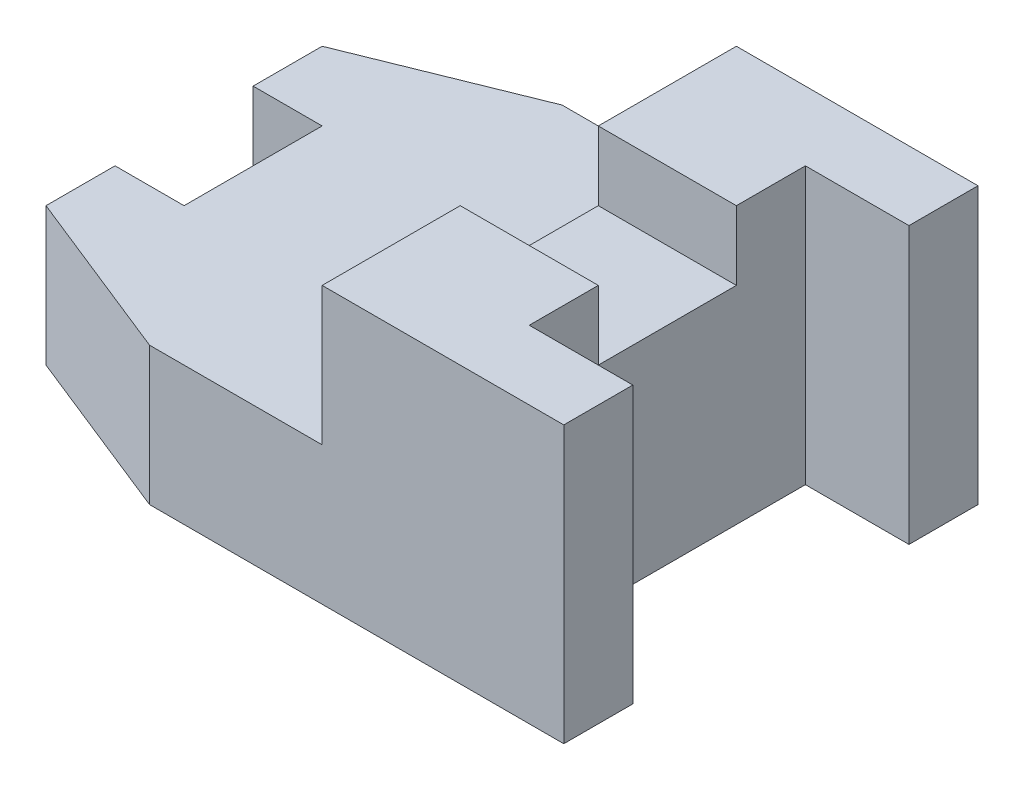
ISO-10303-21;
HEADER;
FILE_DESCRIPTION(('STEP AP214'),'2;1');
FILE_NAME('part.step','',(''),(''),'','','');
FILE_SCHEMA(('AUTOMOTIVE_DESIGN { 1 0 10303 214 1 1 1 1 }'));
ENDSEC;
DATA;
#1=APPLICATION_CONTEXT('core data for automotive mechanical design processes');
#2=APPLICATION_PROTOCOL_DEFINITION('international standard','automotive_design',2000,#1);
#3=PRODUCT_CONTEXT('',#1,'mechanical');
#4=PRODUCT('Part','Part','',(#3));
#5=PRODUCT_RELATED_PRODUCT_CATEGORY('part','',(#4));
#6=PRODUCT_DEFINITION_FORMATION('','',#4);
#7=PRODUCT_DEFINITION_CONTEXT('part definition',#1,'design');
#8=PRODUCT_DEFINITION('design','',#6,#7);
#9=PRODUCT_DEFINITION_SHAPE('','',#8);
#10=(LENGTH_UNIT() NAMED_UNIT(*) SI_UNIT(.MILLI.,.METRE.));
#11=(NAMED_UNIT(*) PLANE_ANGLE_UNIT() SI_UNIT($,.RADIAN.));
#12=(NAMED_UNIT(*) SI_UNIT($,.STERADIAN.) SOLID_ANGLE_UNIT());
#13=UNCERTAINTY_MEASURE_WITH_UNIT(LENGTH_MEASURE(1.E-05),#10,'distance_accuracy_value','');
#14=(GEOMETRIC_REPRESENTATION_CONTEXT(3) GLOBAL_UNCERTAINTY_ASSIGNED_CONTEXT((#13)) GLOBAL_UNIT_ASSIGNED_CONTEXT((#10,
#11,#12)) REPRESENTATION_CONTEXT('',''));
#15=CARTESIAN_POINT('',(0.,0.,0.));
#16=DIRECTION('',(0.,0.,1.));
#17=DIRECTION('',(1.,0.,0.));
#18=AXIS2_PLACEMENT_3D('',#15,#16,#17);
#19=CARTESIAN_POINT('',(-42.5,40.,30.));
#20=DIRECTION('',(1.,0.,0.));
#21=DIRECTION('',(0.,0.,-1.));
#22=AXIS2_PLACEMENT_3D('',#19,#20,#21);
#23=PLANE('',#22);
#24=DIRECTION('',(0.,1.,0.));
#25=VECTOR('',#24,1.);
#26=CARTESIAN_POINT('',(-42.5,0.,-20.));
#27=LINE('',#26,#25);
#28=CARTESIAN_POINT('',(-42.5,0.,-20.));
#29=VERTEX_POINT('',#28);
#30=CARTESIAN_POINT('',(-42.5,20.,-20.));
#31=VERTEX_POINT('',#30);
#32=EDGE_CURVE('E58',#29,#31,#27,.T.);
#33=ORIENTED_EDGE('',*,*,#32,.F.);
#34=DIRECTION('',(0.,0.,1.));
#35=VECTOR('',#34,1.);
#36=CARTESIAN_POINT('',(-42.5,0.,30.));
#37=LINE('',#36,#35);
#38=CARTESIAN_POINT('',(-42.5,0.,-10.));
#39=VERTEX_POINT('',#38);
#40=EDGE_CURVE('E183',#29,#39,#37,.T.);
#41=ORIENTED_EDGE('',*,*,#40,.T.);
#42=DIRECTION('',(0.,-1.,0.));
#43=VECTOR('',#42,1.);
#44=CARTESIAN_POINT('',(-42.5,20.,-10.));
#45=LINE('',#44,#43);
#46=CARTESIAN_POINT('',(-42.5,20.,-10.));
#47=VERTEX_POINT('',#46);
#48=EDGE_CURVE('E312',#47,#39,#45,.T.);
#49=ORIENTED_EDGE('',*,*,#48,.F.);
#50=DIRECTION('',(0.,0.,1.));
#51=VECTOR('',#50,1.);
#52=CARTESIAN_POINT('',(-42.5,20.,30.));
#53=LINE('',#52,#51);
#54=EDGE_CURVE('E185',#31,#47,#53,.T.);
#55=ORIENTED_EDGE('',*,*,#54,.F.);
#56=EDGE_LOOP('',(#33,#41,#49,#55));
#57=FACE_BOUND('',#56,.T.);
#58=ADVANCED_FACE('F36',(#57),#23,.F.);
#59=DIRECTION('',(0.,1.,0.));
#60=VECTOR('',#59,1.);
#61=CARTESIAN_POINT('',(-42.5,0.,20.));
#62=LINE('',#61,#60);
#63=CARTESIAN_POINT('',(-42.5,0.,20.));
#64=VERTEX_POINT('',#63);
#65=CARTESIAN_POINT('',(-42.5,20.,20.));
#66=VERTEX_POINT('',#65);
#67=EDGE_CURVE('E178',#64,#66,#62,.T.);
#68=ORIENTED_EDGE('',*,*,#67,.T.);
#69=CARTESIAN_POINT('',(-42.5,20.,10.));
#70=VERTEX_POINT('',#69);
#71=EDGE_CURVE('E291',#70,#66,#53,.T.);
#72=ORIENTED_EDGE('',*,*,#71,.F.);
#73=DIRECTION('',(0.,1.,0.));
#74=VECTOR('',#73,1.);
#75=CARTESIAN_POINT('',(-42.5,20.,10.));
#76=LINE('',#75,#74);
#77=CARTESIAN_POINT('',(-42.5,0.,10.));
#78=VERTEX_POINT('',#77);
#79=EDGE_CURVE('E309',#78,#70,#76,.T.);
#80=ORIENTED_EDGE('',*,*,#79,.F.);
#81=EDGE_CURVE('E192',#78,#64,#37,.T.);
#82=ORIENTED_EDGE('',*,*,#81,.T.);
#83=EDGE_LOOP('',(#68,#72,#80,#82));
#84=FACE_BOUND('',#83,.T.);
#85=ADVANCED_FACE('F388',(#84),#23,.F.);
#86=CARTESIAN_POINT('',(-42.5,40.,-30.));
#87=DIRECTION('',(0.,0.,1.));
#88=DIRECTION('',(1.,0.,0.));
#89=AXIS2_PLACEMENT_3D('',#86,#87,#88);
#90=PLANE('',#89);
#91=DIRECTION('',(0.,-1.,0.));
#92=VECTOR('',#91,1.);
#93=CARTESIAN_POINT('',(-17.7535111193881,40.,-30.));
#94=LINE('',#93,#92);
#95=CARTESIAN_POINT('',(-17.7535111193881,20.,-30.));
#96=VERTEX_POINT('',#95);
#97=CARTESIAN_POINT('',(-17.7535111193881,0.,-30.));
#98=VERTEX_POINT('',#97);
#99=EDGE_CURVE('E173',#96,#98,#94,.T.);
#100=ORIENTED_EDGE('',*,*,#99,.F.);
#101=DIRECTION('',(-1.,0.,0.));
#102=VECTOR('',#101,1.);
#103=CARTESIAN_POINT('',(-42.5,20.,-30.));
#104=LINE('',#103,#102);
#105=CARTESIAN_POINT('',(7.49999999999999,20.,-30.));
#106=VERTEX_POINT('',#105);
#107=EDGE_CURVE('E292',#106,#96,#104,.T.);
#108=ORIENTED_EDGE('',*,*,#107,.F.);
#109=DIRECTION('',(0.,1.,0.));
#110=VECTOR('',#109,1.);
#111=CARTESIAN_POINT('',(7.49999999999999,40.,-30.));
#112=LINE('',#111,#110);
#113=CARTESIAN_POINT('',(7.49999999999999,40.,-30.));
#114=VERTEX_POINT('',#113);
#115=EDGE_CURVE('E272',#106,#114,#112,.T.);
#116=ORIENTED_EDGE('',*,*,#115,.T.);
#117=DIRECTION('',(-1.,0.,0.));
#118=VECTOR('',#117,1.);
#119=CARTESIAN_POINT('',(-42.5,40.,-30.));
#120=LINE('',#119,#118);
#121=CARTESIAN_POINT('',(42.5,40.,-30.));
#122=VERTEX_POINT('',#121);
#123=EDGE_CURVE('E211',#122,#114,#120,.T.);
#124=ORIENTED_EDGE('',*,*,#123,.F.);
#125=DIRECTION('',(0.,-1.,0.));
#126=VECTOR('',#125,1.);
#127=CARTESIAN_POINT('',(42.5,40.,-30.));
#128=LINE('',#127,#126);
#129=CARTESIAN_POINT('',(42.5,0.,-30.));
#130=VERTEX_POINT('',#129);
#131=EDGE_CURVE('E44',#122,#130,#128,.T.);
#132=ORIENTED_EDGE('',*,*,#131,.T.);
#133=DIRECTION('',(-1.,0.,0.));
#134=VECTOR('',#133,1.);
#135=CARTESIAN_POINT('',(-42.5,0.,-30.));
#136=LINE('',#135,#134);
#137=EDGE_CURVE('E197',#130,#98,#136,.T.);
#138=ORIENTED_EDGE('',*,*,#137,.T.);
#139=EDGE_LOOP('',(#100,#108,#116,#124,#132,#138));
#140=FACE_BOUND('',#139,.T.);
#141=ADVANCED_FACE('F208',(#140),#90,.F.);
#142=CARTESIAN_POINT('',(-42.5,40.,30.));
#143=DIRECTION('',(0.,0.,-1.));
#144=DIRECTION('',(-1.,0.,0.));
#145=AXIS2_PLACEMENT_3D('',#142,#143,#144);
#146=PLANE('',#145);
#147=DIRECTION('',(0.,1.,0.));
#148=VECTOR('',#147,1.);
#149=CARTESIAN_POINT('',(-17.5,0.,30.));
#150=LINE('',#149,#148);
#151=CARTESIAN_POINT('',(-17.5,0.,30.));
#152=VERTEX_POINT('',#151);
#153=CARTESIAN_POINT('',(-17.5,20.,30.));
#154=VERTEX_POINT('',#153);
#155=EDGE_CURVE('E51',#152,#154,#150,.T.);
#156=ORIENTED_EDGE('',*,*,#155,.F.);
#157=DIRECTION('',(1.,0.,0.));
#158=VECTOR('',#157,1.);
#159=CARTESIAN_POINT('',(-42.5,0.,30.));
#160=LINE('',#159,#158);
#161=CARTESIAN_POINT('',(42.5,0.,30.));
#162=VERTEX_POINT('',#161);
#163=EDGE_CURVE('E191',#152,#162,#160,.T.);
#164=ORIENTED_EDGE('',*,*,#163,.T.);
#165=DIRECTION('',(0.,-1.,0.));
#166=VECTOR('',#165,1.);
#167=CARTESIAN_POINT('',(42.5,40.,30.));
#168=LINE('',#167,#166);
#169=CARTESIAN_POINT('',(42.5,40.,30.));
#170=VERTEX_POINT('',#169);
#171=EDGE_CURVE('E201',#170,#162,#168,.T.);
#172=ORIENTED_EDGE('',*,*,#171,.F.);
#173=DIRECTION('',(1.,0.,0.));
#174=VECTOR('',#173,1.);
#175=CARTESIAN_POINT('',(-42.5,40.,30.));
#176=LINE('',#175,#174);
#177=CARTESIAN_POINT('',(7.5,40.,30.));
#178=VERTEX_POINT('',#177);
#179=EDGE_CURVE('E203',#178,#170,#176,.T.);
#180=ORIENTED_EDGE('',*,*,#179,.F.);
#181=DIRECTION('',(0.,-1.,0.));
#182=VECTOR('',#181,1.);
#183=CARTESIAN_POINT('',(7.49999999999999,40.,30.));
#184=LINE('',#183,#182);
#185=CARTESIAN_POINT('',(7.49999999999999,20.,30.));
#186=VERTEX_POINT('',#185);
#187=EDGE_CURVE('E283',#178,#186,#184,.T.);
#188=ORIENTED_EDGE('',*,*,#187,.T.);
#189=DIRECTION('',(1.,0.,0.));
#190=VECTOR('',#189,1.);
#191=CARTESIAN_POINT('',(-42.5,20.,30.));
#192=LINE('',#191,#190);
#193=EDGE_CURVE('E287',#154,#186,#192,.T.);
#194=ORIENTED_EDGE('',*,*,#193,.F.);
#195=EDGE_LOOP('',(#156,#164,#172,#180,#188,#194));
#196=FACE_BOUND('',#195,.T.);
#197=ADVANCED_FACE('F336',(#196),#146,.F.);
#198=CARTESIAN_POINT('',(0.,0.,0.));
#199=DIRECTION('',(0.,-1.,0.));
#200=DIRECTION('',(0.,0.,-1.));
#201=AXIS2_PLACEMENT_3D('',#198,#199,#200);
#202=PLANE('',#201);
#203=ORIENTED_EDGE('',*,*,#40,.F.);
#204=DIRECTION('',(-0.927160826095299,0.,0.374663585839727));
#205=VECTOR('',#204,1.);
#206=CARTESIAN_POINT('',(-17.5,0.,-30.1024432680576));
#207=LINE('',#206,#205);
#208=EDGE_CURVE('E170',#98,#29,#207,.T.);
#209=ORIENTED_EDGE('',*,*,#208,.F.);
#210=ORIENTED_EDGE('',*,*,#137,.F.);
#211=DIRECTION('',(0.,0.,-1.));
#212=VECTOR('',#211,1.);
#213=CARTESIAN_POINT('',(42.5,0.,30.));
#214=LINE('',#213,#212);
#215=CARTESIAN_POINT('',(42.5,0.,-20.));
#216=VERTEX_POINT('',#215);
#217=EDGE_CURVE('E216',#216,#130,#214,.T.);
#218=ORIENTED_EDGE('',*,*,#217,.F.);
#219=DIRECTION('',(-1.,0.,0.));
#220=VECTOR('',#219,1.);
#221=CARTESIAN_POINT('',(42.5,0.,-20.));
#222=LINE('',#221,#220);
#223=CARTESIAN_POINT('',(27.5,0.,-20.));
#224=VERTEX_POINT('',#223);
#225=EDGE_CURVE('E241',#216,#224,#222,.T.);
#226=ORIENTED_EDGE('',*,*,#225,.T.);
#227=DIRECTION('',(0.,0.,1.));
#228=VECTOR('',#227,1.);
#229=CARTESIAN_POINT('',(27.5,0.,-20.));
#230=LINE('',#229,#228);
#231=CARTESIAN_POINT('',(27.5,0.,20.));
#232=VERTEX_POINT('',#231);
#233=EDGE_CURVE('E252',#224,#232,#230,.T.);
#234=ORIENTED_EDGE('',*,*,#233,.T.);
#235=DIRECTION('',(1.,0.,0.));
#236=VECTOR('',#235,1.);
#237=CARTESIAN_POINT('',(42.5,0.,20.));
#238=LINE('',#237,#236);
#239=CARTESIAN_POINT('',(42.5,0.,20.));
#240=VERTEX_POINT('',#239);
#241=EDGE_CURVE('E233',#232,#240,#238,.T.);
#242=ORIENTED_EDGE('',*,*,#241,.T.);
#243=EDGE_CURVE('E219',#162,#240,#214,.T.);
#244=ORIENTED_EDGE('',*,*,#243,.F.);
#245=ORIENTED_EDGE('',*,*,#163,.F.);
#246=DIRECTION('',(0.928476690885259,0.,0.371390676354104));
#247=VECTOR('',#246,1.);
#248=CARTESIAN_POINT('',(-42.5,0.,20.));
#249=LINE('',#248,#247);
#250=EDGE_CURVE('E325',#64,#152,#249,.T.);
#251=ORIENTED_EDGE('',*,*,#250,.F.);
#252=ORIENTED_EDGE('',*,*,#81,.F.);
#253=DIRECTION('',(-1.,0.,0.));
#254=VECTOR('',#253,1.);
#255=CARTESIAN_POINT('',(-32.5,0.,10.));
#256=LINE('',#255,#254);
#257=CARTESIAN_POINT('',(-32.5,0.,10.));
#258=VERTEX_POINT('',#257);
#259=EDGE_CURVE('E301',#258,#78,#256,.T.);
#260=ORIENTED_EDGE('',*,*,#259,.F.);
#261=DIRECTION('',(0.,0.,1.));
#262=VECTOR('',#261,1.);
#263=CARTESIAN_POINT('',(-32.5,0.,-10.));
#264=LINE('',#263,#262);
#265=CARTESIAN_POINT('',(-32.5,0.,-10.));
#266=VERTEX_POINT('',#265);
#267=EDGE_CURVE('E318',#266,#258,#264,.T.);
#268=ORIENTED_EDGE('',*,*,#267,.F.);
#269=DIRECTION('',(-1.,0.,0.));
#270=VECTOR('',#269,1.);
#271=CARTESIAN_POINT('',(-32.5,0.,-10.));
#272=LINE('',#271,#270);
#273=EDGE_CURVE('E190',#266,#39,#272,.T.);
#274=ORIENTED_EDGE('',*,*,#273,.T.);
#275=EDGE_LOOP('',(#203,#209,#210,#218,#226,#234,#242,#244,#245,#251,#252,#260,#268,#274));
#276=FACE_BOUND('',#275,.T.);
#277=ADVANCED_FACE('F188',(#276),#202,.T.);
#278=CARTESIAN_POINT('',(0.,20.,0.));
#279=DIRECTION('',(0.,-1.,0.));
#280=DIRECTION('',(0.,0.,-1.));
#281=AXIS2_PLACEMENT_3D('',#278,#279,#280);
#282=PLANE('',#281);
#283=DIRECTION('',(0.927160826095299,0.,-0.374663585839727));
#284=VECTOR('',#283,1.);
#285=CARTESIAN_POINT('',(-12.9133121036568,20.,-31.9559134385014));
#286=LINE('',#285,#284);
#287=EDGE_CURVE('E11',#31,#96,#286,.T.);
#288=ORIENTED_EDGE('',*,*,#287,.F.);
#289=ORIENTED_EDGE('',*,*,#54,.T.);
#290=DIRECTION('',(-1.,0.,0.));
#291=VECTOR('',#290,1.);
#292=CARTESIAN_POINT('',(-32.5,20.,-10.));
#293=LINE('',#292,#291);
#294=CARTESIAN_POINT('',(-32.5,20.,-10.));
#295=VERTEX_POINT('',#294);
#296=EDGE_CURVE('E295',#295,#47,#293,.T.);
#297=ORIENTED_EDGE('',*,*,#296,.F.);
#298=DIRECTION('',(0.,0.,-1.));
#299=VECTOR('',#298,1.);
#300=CARTESIAN_POINT('',(-32.5,20.,-10.));
#301=LINE('',#300,#299);
#302=CARTESIAN_POINT('',(-32.5,20.,10.));
#303=VERTEX_POINT('',#302);
#304=EDGE_CURVE('E302',#303,#295,#301,.T.);
#305=ORIENTED_EDGE('',*,*,#304,.F.);
#306=DIRECTION('',(-1.,0.,0.));
#307=VECTOR('',#306,1.);
#308=CARTESIAN_POINT('',(-32.5,20.,10.));
#309=LINE('',#308,#307);
#310=EDGE_CURVE('E304',#303,#70,#309,.T.);
#311=ORIENTED_EDGE('',*,*,#310,.T.);
#312=ORIENTED_EDGE('',*,*,#71,.T.);
#313=DIRECTION('',(0.928476690885259,0.,0.371390676354104));
#314=VECTOR('',#313,1.);
#315=CARTESIAN_POINT('',(-42.5,20.,20.));
#316=LINE('',#315,#314);
#317=EDGE_CURVE('E328',#66,#154,#316,.T.);
#318=ORIENTED_EDGE('',*,*,#317,.T.);
#319=ORIENTED_EDGE('',*,*,#193,.T.);
#320=DIRECTION('',(0.,0.,-1.));
#321=VECTOR('',#320,1.);
#322=CARTESIAN_POINT('',(7.49999999999999,20.,-33.3860249262818));
#323=LINE('',#322,#321);
#324=EDGE_CURVE('E286',#186,#106,#323,.T.);
#325=ORIENTED_EDGE('',*,*,#324,.T.);
#326=ORIENTED_EDGE('',*,*,#107,.T.);
#327=EDGE_LOOP('',(#288,#289,#297,#305,#311,#312,#318,#319,#325,#326));
#328=FACE_BOUND('',#327,.T.);
#329=ADVANCED_FACE('F355',(#328),#282,.F.);
#330=CARTESIAN_POINT('',(0.,40.,0.));
#331=DIRECTION('',(0.,-1.,0.));
#332=DIRECTION('',(0.,0.,-1.));
#333=AXIS2_PLACEMENT_3D('',#330,#331,#332);
#334=PLANE('',#333);
#335=DIRECTION('',(0.,0.,-1.));
#336=VECTOR('',#335,1.);
#337=CARTESIAN_POINT('',(7.49999999999999,40.,-33.3860249262818));
#338=LINE('',#337,#336);
#339=CARTESIAN_POINT('',(7.49999999999999,40.,10.));
#340=VERTEX_POINT('',#339);
#341=EDGE_CURVE('E297',#178,#340,#338,.T.);
#342=ORIENTED_EDGE('',*,*,#341,.F.);
#343=ORIENTED_EDGE('',*,*,#179,.T.);
#344=DIRECTION('',(0.,0.,-1.));
#345=VECTOR('',#344,1.);
#346=CARTESIAN_POINT('',(42.5,40.,30.));
#347=LINE('',#346,#345);
#348=CARTESIAN_POINT('',(42.5,40.,20.));
#349=VERTEX_POINT('',#348);
#350=EDGE_CURVE('E228',#170,#349,#347,.T.);
#351=ORIENTED_EDGE('',*,*,#350,.T.);
#352=DIRECTION('',(1.,0.,0.));
#353=VECTOR('',#352,1.);
#354=CARTESIAN_POINT('',(42.5,40.,20.));
#355=LINE('',#354,#353);
#356=CARTESIAN_POINT('',(27.5,40.,20.));
#357=VERTEX_POINT('',#356);
#358=EDGE_CURVE('E239',#357,#349,#355,.T.);
#359=ORIENTED_EDGE('',*,*,#358,.F.);
#360=DIRECTION('',(0.,0.,1.));
#361=VECTOR('',#360,1.);
#362=CARTESIAN_POINT('',(27.5,40.,-20.));
#363=LINE('',#362,#361);
#364=CARTESIAN_POINT('',(27.5,40.,10.));
#365=VERTEX_POINT('',#364);
#366=EDGE_CURVE('E245',#365,#357,#363,.T.);
#367=ORIENTED_EDGE('',*,*,#366,.F.);
#368=DIRECTION('',(1.,0.,0.));
#369=VECTOR('',#368,1.);
#370=CARTESIAN_POINT('',(27.5,40.,10.));
#371=LINE('',#370,#369);
#372=EDGE_CURVE('E266',#340,#365,#371,.T.);
#373=ORIENTED_EDGE('',*,*,#372,.F.);
#374=EDGE_LOOP('',(#342,#343,#351,#359,#367,#373));
#375=FACE_BOUND('',#374,.T.);
#376=ADVANCED_FACE('F346',(#375),#334,.F.);
#377=CARTESIAN_POINT('',(7.49999999999999,40.,-9.99999999999999));
#378=VERTEX_POINT('',#377);
#379=EDGE_CURVE('E289',#378,#114,#338,.T.);
#380=ORIENTED_EDGE('',*,*,#379,.F.);
#381=DIRECTION('',(-1.,0.,0.));
#382=VECTOR('',#381,1.);
#383=CARTESIAN_POINT('',(27.5,40.,-9.99999999999999));
#384=LINE('',#383,#382);
#385=CARTESIAN_POINT('',(27.5,40.,-9.99999999999999));
#386=VERTEX_POINT('',#385);
#387=EDGE_CURVE('E269',#386,#378,#384,.T.);
#388=ORIENTED_EDGE('',*,*,#387,.F.);
#389=CARTESIAN_POINT('',(27.5,40.,-20.));
#390=VERTEX_POINT('',#389);
#391=EDGE_CURVE('E242',#390,#386,#363,.T.);
#392=ORIENTED_EDGE('',*,*,#391,.F.);
#393=DIRECTION('',(-1.,0.,0.));
#394=VECTOR('',#393,1.);
#395=CARTESIAN_POINT('',(42.5,40.,-20.));
#396=LINE('',#395,#394);
#397=CARTESIAN_POINT('',(42.5,40.,-20.));
#398=VERTEX_POINT('',#397);
#399=EDGE_CURVE('E246',#398,#390,#396,.T.);
#400=ORIENTED_EDGE('',*,*,#399,.F.);
#401=EDGE_CURVE('E194',#398,#122,#347,.T.);
#402=ORIENTED_EDGE('',*,*,#401,.T.);
#403=ORIENTED_EDGE('',*,*,#123,.T.);
#404=EDGE_LOOP('',(#380,#388,#392,#400,#402,#403));
#405=FACE_BOUND('',#404,.T.);
#406=ADVANCED_FACE('F358',(#405),#334,.F.);
#407=CARTESIAN_POINT('',(42.5,40.,30.));
#408=DIRECTION('',(-1.,0.,0.));
#409=DIRECTION('',(0.,0.,1.));
#410=AXIS2_PLACEMENT_3D('',#407,#408,#409);
#411=PLANE('',#410);
#412=ORIENTED_EDGE('',*,*,#243,.T.);
#413=DIRECTION('',(0.,1.,0.));
#414=VECTOR('',#413,1.);
#415=CARTESIAN_POINT('',(42.5,0.,20.));
#416=LINE('',#415,#414);
#417=EDGE_CURVE('E220',#240,#349,#416,.T.);
#418=ORIENTED_EDGE('',*,*,#417,.T.);
#419=ORIENTED_EDGE('',*,*,#350,.F.);
#420=ORIENTED_EDGE('',*,*,#171,.T.);
#421=EDGE_LOOP('',(#412,#418,#419,#420));
#422=FACE_BOUND('',#421,.T.);
#423=ADVANCED_FACE('F343',(#422),#411,.F.);
#424=ORIENTED_EDGE('',*,*,#401,.F.);
#425=DIRECTION('',(0.,1.,0.));
#426=VECTOR('',#425,1.);
#427=CARTESIAN_POINT('',(42.5,0.,-20.));
#428=LINE('',#427,#426);
#429=EDGE_CURVE('E217',#216,#398,#428,.T.);
#430=ORIENTED_EDGE('',*,*,#429,.F.);
#431=ORIENTED_EDGE('',*,*,#217,.T.);
#432=ORIENTED_EDGE('',*,*,#131,.F.);
#433=EDGE_LOOP('',(#424,#430,#431,#432));
#434=FACE_BOUND('',#433,.T.);
#435=ADVANCED_FACE('F38',(#434),#411,.F.);
#436=CARTESIAN_POINT('',(42.5,0.,20.));
#437=DIRECTION('',(0.,0.,1.));
#438=DIRECTION('',(1.,0.,0.));
#439=AXIS2_PLACEMENT_3D('',#436,#437,#438);
#440=PLANE('',#439);
#441=ORIENTED_EDGE('',*,*,#358,.T.);
#442=ORIENTED_EDGE('',*,*,#417,.F.);
#443=ORIENTED_EDGE('',*,*,#241,.F.);
#444=DIRECTION('',(0.,1.,0.));
#445=VECTOR('',#444,1.);
#446=CARTESIAN_POINT('',(27.5,0.,20.));
#447=LINE('',#446,#445);
#448=EDGE_CURVE('E235',#232,#357,#447,.T.);
#449=ORIENTED_EDGE('',*,*,#448,.T.);
#450=EDGE_LOOP('',(#441,#442,#443,#449));
#451=FACE_BOUND('',#450,.T.);
#452=ADVANCED_FACE('F340',(#451),#440,.F.);
#453=CARTESIAN_POINT('',(27.5,0.,-20.));
#454=DIRECTION('',(-1.,0.,0.));
#455=DIRECTION('',(0.,0.,1.));
#456=AXIS2_PLACEMENT_3D('',#453,#454,#455);
#457=PLANE('',#456);
#458=DIRECTION('',(0.,0.,-1.));
#459=VECTOR('',#458,1.);
#460=CARTESIAN_POINT('',(27.5,30.,-9.99999999999999));
#461=LINE('',#460,#459);
#462=CARTESIAN_POINT('',(27.5,30.,10.));
#463=VERTEX_POINT('',#462);
#464=CARTESIAN_POINT('',(27.5,30.,-9.99999999999999));
#465=VERTEX_POINT('',#464);
#466=EDGE_CURVE('E268',#463,#465,#461,.T.);
#467=ORIENTED_EDGE('',*,*,#466,.F.);
#468=DIRECTION('',(0.,1.,0.));
#469=VECTOR('',#468,1.);
#470=CARTESIAN_POINT('',(27.5,30.,10.));
#471=LINE('',#470,#469);
#472=EDGE_CURVE('E249',#463,#365,#471,.T.);
#473=ORIENTED_EDGE('',*,*,#472,.T.);
#474=ORIENTED_EDGE('',*,*,#366,.T.);
#475=ORIENTED_EDGE('',*,*,#448,.F.);
#476=ORIENTED_EDGE('',*,*,#233,.F.);
#477=DIRECTION('',(0.,1.,0.));
#478=VECTOR('',#477,1.);
#479=CARTESIAN_POINT('',(27.5,0.,-20.));
#480=LINE('',#479,#478);
#481=EDGE_CURVE('E232',#224,#390,#480,.T.);
#482=ORIENTED_EDGE('',*,*,#481,.T.);
#483=ORIENTED_EDGE('',*,*,#391,.T.);
#484=DIRECTION('',(0.,1.,0.));
#485=VECTOR('',#484,1.);
#486=CARTESIAN_POINT('',(27.5,30.,-9.99999999999999));
#487=LINE('',#486,#485);
#488=EDGE_CURVE('E256',#465,#386,#487,.T.);
#489=ORIENTED_EDGE('',*,*,#488,.F.);
#490=EDGE_LOOP('',(#467,#473,#474,#475,#476,#482,#483,#489));
#491=FACE_BOUND('',#490,.T.);
#492=ADVANCED_FACE('F367',(#491),#457,.F.);
#493=CARTESIAN_POINT('',(42.5,0.,-20.));
#494=DIRECTION('',(0.,0.,-1.));
#495=DIRECTION('',(-1.,0.,0.));
#496=AXIS2_PLACEMENT_3D('',#493,#494,#495);
#497=PLANE('',#496);
#498=ORIENTED_EDGE('',*,*,#399,.T.);
#499=ORIENTED_EDGE('',*,*,#481,.F.);
#500=ORIENTED_EDGE('',*,*,#225,.F.);
#501=ORIENTED_EDGE('',*,*,#429,.T.);
#502=EDGE_LOOP('',(#498,#499,#500,#501));
#503=FACE_BOUND('',#502,.T.);
#504=ADVANCED_FACE('F364',(#503),#497,.F.);
#505=CARTESIAN_POINT('',(27.5,30.,10.));
#506=DIRECTION('',(0.,0.,1.));
#507=DIRECTION('',(1.,0.,0.));
#508=AXIS2_PLACEMENT_3D('',#505,#506,#507);
#509=PLANE('',#508);
#510=ORIENTED_EDGE('',*,*,#372,.T.);
#511=ORIENTED_EDGE('',*,*,#472,.F.);
#512=DIRECTION('',(1.,0.,0.));
#513=VECTOR('',#512,1.);
#514=CARTESIAN_POINT('',(27.5,30.,10.));
#515=LINE('',#514,#513);
#516=CARTESIAN_POINT('',(7.49999999999999,30.,10.));
#517=VERTEX_POINT('',#516);
#518=EDGE_CURVE('E259',#517,#463,#515,.T.);
#519=ORIENTED_EDGE('',*,*,#518,.F.);
#520=DIRECTION('',(0.,1.,0.));
#521=VECTOR('',#520,1.);
#522=CARTESIAN_POINT('',(7.49999999999999,30.,10.));
#523=LINE('',#522,#521);
#524=EDGE_CURVE('E261',#517,#340,#523,.T.);
#525=ORIENTED_EDGE('',*,*,#524,.T.);
#526=EDGE_LOOP('',(#510,#511,#519,#525));
#527=FACE_BOUND('',#526,.T.);
#528=ADVANCED_FACE('F371',(#527),#509,.F.);
#529=CARTESIAN_POINT('',(27.5,30.,-9.99999999999999));
#530=DIRECTION('',(0.,0.,-1.));
#531=DIRECTION('',(-1.,0.,0.));
#532=AXIS2_PLACEMENT_3D('',#529,#530,#531);
#533=PLANE('',#532);
#534=ORIENTED_EDGE('',*,*,#387,.T.);
#535=DIRECTION('',(0.,1.,0.));
#536=VECTOR('',#535,1.);
#537=CARTESIAN_POINT('',(7.49999999999999,30.,-9.99999999999999));
#538=LINE('',#537,#536);
#539=CARTESIAN_POINT('',(7.49999999999999,30.,-9.99999999999999));
#540=VERTEX_POINT('',#539);
#541=EDGE_CURVE('E258',#540,#378,#538,.T.);
#542=ORIENTED_EDGE('',*,*,#541,.F.);
#543=DIRECTION('',(-1.,0.,0.));
#544=VECTOR('',#543,1.);
#545=CARTESIAN_POINT('',(27.5,30.,-9.99999999999999));
#546=LINE('',#545,#544);
#547=EDGE_CURVE('E277',#465,#540,#546,.T.);
#548=ORIENTED_EDGE('',*,*,#547,.F.);
#549=ORIENTED_EDGE('',*,*,#488,.T.);
#550=EDGE_LOOP('',(#534,#542,#548,#549));
#551=FACE_BOUND('',#550,.T.);
#552=ADVANCED_FACE('F377',(#551),#533,.F.);
#553=CARTESIAN_POINT('',(0.,30.,0.));
#554=DIRECTION('',(0.,-1.,0.));
#555=DIRECTION('',(0.,0.,-1.));
#556=AXIS2_PLACEMENT_3D('',#553,#554,#555);
#557=PLANE('',#556);
#558=ORIENTED_EDGE('',*,*,#466,.T.);
#559=ORIENTED_EDGE('',*,*,#547,.T.);
#560=DIRECTION('',(0.,0.,1.));
#561=VECTOR('',#560,1.);
#562=CARTESIAN_POINT('',(7.49999999999999,30.,-9.99999999999999));
#563=LINE('',#562,#561);
#564=EDGE_CURVE('E274',#540,#517,#563,.T.);
#565=ORIENTED_EDGE('',*,*,#564,.T.);
#566=ORIENTED_EDGE('',*,*,#518,.T.);
#567=EDGE_LOOP('',(#558,#559,#565,#566));
#568=FACE_BOUND('',#567,.T.);
#569=ADVANCED_FACE('F375',(#568),#557,.F.);
#570=CARTESIAN_POINT('',(7.49999999999999,229.33435506005,-33.3860249262818));
#571=DIRECTION('',(1.,0.,0.));
#572=DIRECTION('',(0.,0.,-1.));
#573=AXIS2_PLACEMENT_3D('',#570,#571,#572);
#574=PLANE('',#573);
#575=ORIENTED_EDGE('',*,*,#524,.F.);
#576=ORIENTED_EDGE('',*,*,#564,.F.);
#577=ORIENTED_EDGE('',*,*,#541,.T.);
#578=ORIENTED_EDGE('',*,*,#379,.T.);
#579=ORIENTED_EDGE('',*,*,#115,.F.);
#580=ORIENTED_EDGE('',*,*,#324,.F.);
#581=ORIENTED_EDGE('',*,*,#187,.F.);
#582=ORIENTED_EDGE('',*,*,#341,.T.);
#583=EDGE_LOOP('',(#575,#576,#577,#578,#579,#580,#581,#582));
#584=FACE_BOUND('',#583,.T.);
#585=ADVANCED_FACE('F352',(#584),#574,.F.);
#586=CARTESIAN_POINT('',(-32.5,20.,-10.));
#587=DIRECTION('',(0.,0.,-1.));
#588=DIRECTION('',(0.,1.,0.));
#589=AXIS2_PLACEMENT_3D('',#586,#587,#588);
#590=PLANE('',#589);
#591=ORIENTED_EDGE('',*,*,#48,.T.);
#592=ORIENTED_EDGE('',*,*,#273,.F.);
#593=DIRECTION('',(0.,-1.,0.));
#594=VECTOR('',#593,1.);
#595=CARTESIAN_POINT('',(-32.5,20.,-10.));
#596=LINE('',#595,#594);
#597=EDGE_CURVE('E311',#295,#266,#596,.T.);
#598=ORIENTED_EDGE('',*,*,#597,.F.);
#599=ORIENTED_EDGE('',*,*,#296,.T.);
#600=EDGE_LOOP('',(#591,#592,#598,#599));
#601=FACE_BOUND('',#600,.T.);
#602=ADVANCED_FACE('F505',(#601),#590,.F.);
#603=CARTESIAN_POINT('',(-32.5,20.,10.));
#604=DIRECTION('',(0.,0.,1.));
#605=DIRECTION('',(0.,-1.,0.));
#606=AXIS2_PLACEMENT_3D('',#603,#604,#605);
#607=PLANE('',#606);
#608=ORIENTED_EDGE('',*,*,#79,.T.);
#609=ORIENTED_EDGE('',*,*,#310,.F.);
#610=DIRECTION('',(0.,1.,0.));
#611=VECTOR('',#610,1.);
#612=CARTESIAN_POINT('',(-32.5,20.,10.));
#613=LINE('',#612,#611);
#614=EDGE_CURVE('E316',#258,#303,#613,.T.);
#615=ORIENTED_EDGE('',*,*,#614,.F.);
#616=ORIENTED_EDGE('',*,*,#259,.T.);
#617=EDGE_LOOP('',(#608,#609,#615,#616));
#618=FACE_BOUND('',#617,.T.);
#619=ADVANCED_FACE('F496',(#618),#607,.F.);
#620=CARTESIAN_POINT('',(-32.5,0.,0.));
#621=DIRECTION('',(-1.,0.,0.));
#622=DIRECTION('',(0.,0.,1.));
#623=AXIS2_PLACEMENT_3D('',#620,#621,#622);
#624=PLANE('',#623);
#625=ORIENTED_EDGE('',*,*,#597,.T.);
#626=ORIENTED_EDGE('',*,*,#267,.T.);
#627=ORIENTED_EDGE('',*,*,#614,.T.);
#628=ORIENTED_EDGE('',*,*,#304,.T.);
#629=EDGE_LOOP('',(#625,#626,#627,#628));
#630=FACE_BOUND('',#629,.T.);
#631=ADVANCED_FACE('F448',(#630),#624,.T.);
#632=CARTESIAN_POINT('',(-42.5,0.,20.));
#633=DIRECTION('',(-0.371390676354104,0.,0.928476690885259));
#634=DIRECTION('',(0.928476690885259,0.,0.371390676354104));
#635=AXIS2_PLACEMENT_3D('',#632,#633,#634);
#636=PLANE('',#635);
#637=ORIENTED_EDGE('',*,*,#317,.F.);
#638=ORIENTED_EDGE('',*,*,#67,.F.);
#639=ORIENTED_EDGE('',*,*,#250,.T.);
#640=ORIENTED_EDGE('',*,*,#155,.T.);
#641=EDGE_LOOP('',(#637,#638,#639,#640));
#642=FACE_BOUND('',#641,.T.);
#643=ADVANCED_FACE('F331',(#642),#636,.T.);
#644=CARTESIAN_POINT('',(-17.5,0.,-30.1024432680576));
#645=DIRECTION('',(-0.374663585839727,0.,-0.927160826095299));
#646=DIRECTION('',(-0.927160826095299,0.,0.374663585839727));
#647=AXIS2_PLACEMENT_3D('',#644,#645,#646);
#648=PLANE('',#647);
#649=ORIENTED_EDGE('',*,*,#99,.T.);
#650=ORIENTED_EDGE('',*,*,#208,.T.);
#651=ORIENTED_EDGE('',*,*,#32,.T.);
#652=ORIENTED_EDGE('',*,*,#287,.T.);
#653=EDGE_LOOP('',(#649,#650,#651,#652));
#654=FACE_BOUND('',#653,.T.);
#655=ADVANCED_FACE('F171',(#654),#648,.T.);
#656=CLOSED_SHELL('',(#58,#85,#141,#197,#277,#329,#376,#406,#423,#435,#452,#492,#504,#528,#552,
#569,#585,#602,#619,#631,#643,#655));
#657=MANIFOLD_SOLID_BREP('B2',#656);
#658=ADVANCED_BREP_SHAPE_REPRESENTATION('',(#18,#657),#14);
#659=SHAPE_DEFINITION_REPRESENTATION(#9,#658);
ENDSEC;
END-ISO-10303-21;
